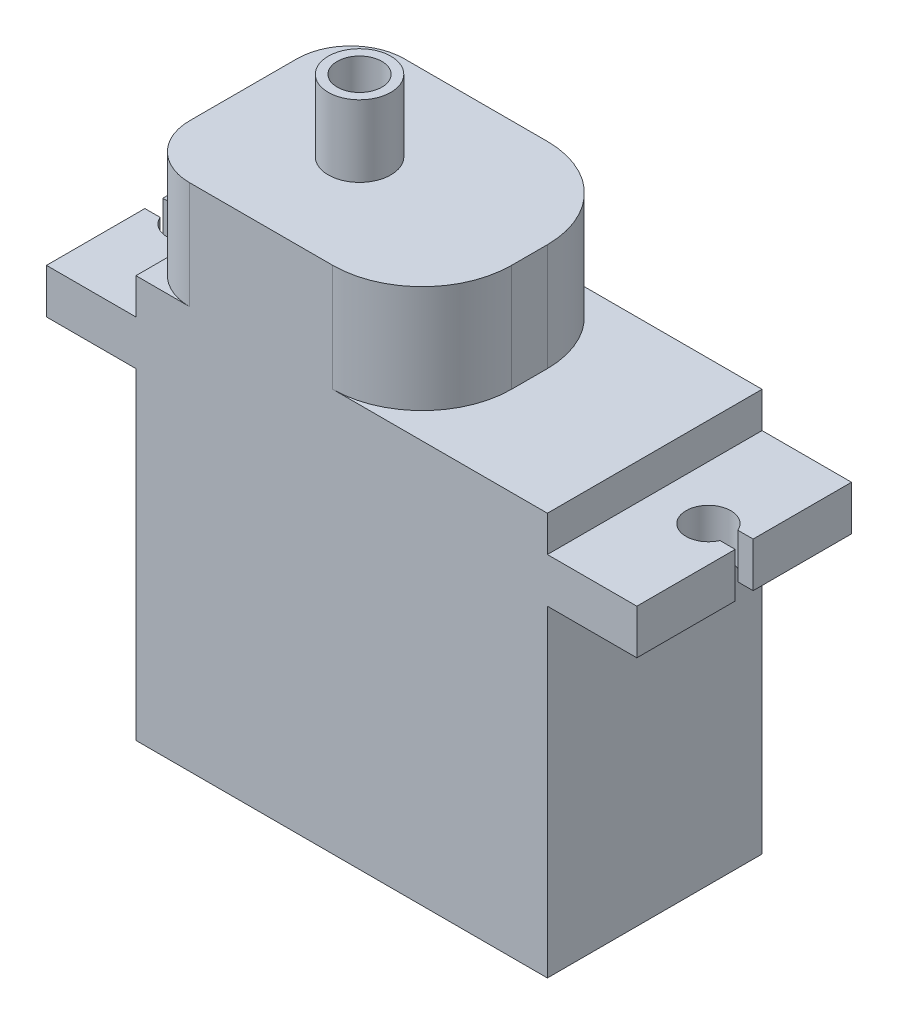
ISO-10303-21;
HEADER;
FILE_DESCRIPTION(('STEP AP214'),'2;1');
FILE_NAME('part.step','',(''),(''),'','','');
FILE_SCHEMA(('AUTOMOTIVE_DESIGN { 1 0 10303 214 1 1 1 1 }'));
ENDSEC;
DATA;
#1=APPLICATION_CONTEXT('core data for automotive mechanical design processes');
#2=APPLICATION_PROTOCOL_DEFINITION('international standard','automotive_design',2000,#1);
#3=PRODUCT_CONTEXT('',#1,'mechanical');
#4=PRODUCT('Part','Part','',(#3));
#5=PRODUCT_RELATED_PRODUCT_CATEGORY('part','',(#4));
#6=PRODUCT_DEFINITION_FORMATION('','',#4);
#7=PRODUCT_DEFINITION_CONTEXT('part definition',#1,'design');
#8=PRODUCT_DEFINITION('design','',#6,#7);
#9=PRODUCT_DEFINITION_SHAPE('','',#8);
#10=(LENGTH_UNIT() NAMED_UNIT(*) SI_UNIT(.MILLI.,.METRE.));
#11=(NAMED_UNIT(*) PLANE_ANGLE_UNIT() SI_UNIT($,.RADIAN.));
#12=(NAMED_UNIT(*) SI_UNIT($,.STERADIAN.) SOLID_ANGLE_UNIT());
#13=UNCERTAINTY_MEASURE_WITH_UNIT(LENGTH_MEASURE(1.E-05),#10,'distance_accuracy_value','');
#14=(GEOMETRIC_REPRESENTATION_CONTEXT(3) GLOBAL_UNCERTAINTY_ASSIGNED_CONTEXT((#13)) GLOBAL_UNIT_ASSIGNED_CONTEXT((#10,
#11,#12)) REPRESENTATION_CONTEXT('',''));
#15=CARTESIAN_POINT('',(0.,0.,0.));
#16=DIRECTION('',(0.,0.,1.));
#17=DIRECTION('',(1.,0.,0.));
#18=AXIS2_PLACEMENT_3D('',#15,#16,#17);
#19=CARTESIAN_POINT('',(0.,22.5,0.));
#20=DIRECTION('',(0.,1.,0.));
#21=DIRECTION('',(0.,0.,1.));
#22=AXIS2_PLACEMENT_3D('',#19,#20,#21);
#23=PLANE('',#22);
#24=DIRECTION('',(0.,0.,-1.));
#25=VECTOR('',#24,1.);
#26=CARTESIAN_POINT('',(4.5,22.5,-6.));
#27=LINE('',#26,#25);
#28=CARTESIAN_POINT('',(4.5,22.5,0.999999999999999));
#29=VERTEX_POINT('',#28);
#30=CARTESIAN_POINT('',(4.5,22.5,-1.));
#31=VERTEX_POINT('',#30);
#32=EDGE_CURVE('E255',#29,#31,#27,.T.);
#33=ORIENTED_EDGE('',*,*,#32,.F.);
#34=CARTESIAN_POINT('',(-0.499999999999996,22.5,0.999999999999999));
#35=DIRECTION('',(0.,1.,0.));
#36=DIRECTION('',(0.,0.,1.));
#37=AXIS2_PLACEMENT_3D('',#34,#35,#36);
#38=CIRCLE('',#37,5.);
#39=CARTESIAN_POINT('',(-0.499999999999996,22.5,6.));
#40=VERTEX_POINT('',#39);
#41=EDGE_CURVE('E11',#29,#40,#38,.F.);
#42=ORIENTED_EDGE('',*,*,#41,.T.);
#43=DIRECTION('',(1.,0.,0.));
#44=VECTOR('',#43,1.);
#45=CARTESIAN_POINT('',(-11.5,22.5,6.));
#46=LINE('',#45,#44);
#47=CARTESIAN_POINT('',(11.5,22.5,6.));
#48=VERTEX_POINT('',#47);
#49=EDGE_CURVE('E49',#40,#48,#46,.T.);
#50=ORIENTED_EDGE('',*,*,#49,.T.);
#51=DIRECTION('',(0.,0.,-1.));
#52=VECTOR('',#51,1.);
#53=CARTESIAN_POINT('',(11.5,22.5,-6.));
#54=LINE('',#53,#52);
#55=CARTESIAN_POINT('',(11.5,22.5,-6.));
#56=VERTEX_POINT('',#55);
#57=EDGE_CURVE('E369',#48,#56,#54,.T.);
#58=ORIENTED_EDGE('',*,*,#57,.T.);
#59=DIRECTION('',(-1.,0.,0.));
#60=VECTOR('',#59,1.);
#61=CARTESIAN_POINT('',(-11.5,22.5,-6.));
#62=LINE('',#61,#60);
#63=CARTESIAN_POINT('',(-0.499999999999997,22.5,-6.));
#64=VERTEX_POINT('',#63);
#65=EDGE_CURVE('E373',#56,#64,#62,.T.);
#66=ORIENTED_EDGE('',*,*,#65,.T.);
#67=CARTESIAN_POINT('',(-0.499999999999997,22.5,-1.));
#68=DIRECTION('',(0.,1.,0.));
#69=DIRECTION('',(0.,0.,1.));
#70=AXIS2_PLACEMENT_3D('',#67,#68,#69);
#71=CIRCLE('',#70,5.);
#72=EDGE_CURVE('E42',#64,#31,#71,.F.);
#73=ORIENTED_EDGE('',*,*,#72,.T.);
#74=EDGE_LOOP('',(#33,#42,#50,#58,#66,#73));
#75=FACE_BOUND('',#74,.T.);
#76=ADVANCED_FACE('F34',(#75),#23,.T.);
#77=CARTESIAN_POINT('',(-8.49999999999999,22.5,3.));
#78=DIRECTION('',(0.,1.,0.));
#79=DIRECTION('',(0.,0.,1.));
#80=AXIS2_PLACEMENT_3D('',#77,#78,#79);
#81=CIRCLE('',#80,3.);
#82=CARTESIAN_POINT('',(-11.5,22.5,3.));
#83=VERTEX_POINT('',#82);
#84=CARTESIAN_POINT('',(-8.49999999999999,22.5,6.));
#85=VERTEX_POINT('',#84);
#86=EDGE_CURVE('E261',#83,#85,#81,.T.);
#87=ORIENTED_EDGE('',*,*,#86,.F.);
#88=DIRECTION('',(0.,0.,1.));
#89=VECTOR('',#88,1.);
#90=CARTESIAN_POINT('',(-11.5,22.5,-6.));
#91=LINE('',#90,#89);
#92=CARTESIAN_POINT('',(-11.5,22.5,6.));
#93=VERTEX_POINT('',#92);
#94=EDGE_CURVE('E375',#83,#93,#91,.T.);
#95=ORIENTED_EDGE('',*,*,#94,.T.);
#96=EDGE_CURVE('E378',#93,#85,#46,.T.);
#97=ORIENTED_EDGE('',*,*,#96,.T.);
#98=EDGE_LOOP('',(#87,#95,#97));
#99=FACE_BOUND('',#98,.T.);
#100=ADVANCED_FACE('F507',(#99),#23,.T.);
#101=CARTESIAN_POINT('',(-16.5,20.5,6.));
#102=DIRECTION('',(0.,1.,0.));
#103=DIRECTION('',(0.,0.,1.));
#104=AXIS2_PLACEMENT_3D('',#101,#102,#103);
#105=PLANE('',#104);
#106=CARTESIAN_POINT('',(-14.5,20.5,0.));
#107=DIRECTION('',(0.,-1.,0.));
#108=DIRECTION('',(0.,0.,1.));
#109=AXIS2_PLACEMENT_3D('',#106,#107,#108);
#110=CIRCLE('',#109,1.25);
#111=CARTESIAN_POINT('',(-15.645643923739,20.5,-0.5));
#112=VERTEX_POINT('',#111);
#113=CARTESIAN_POINT('',(-15.645643923739,20.5,0.5));
#114=VERTEX_POINT('',#113);
#115=EDGE_CURVE('E239',#112,#114,#110,.T.);
#116=ORIENTED_EDGE('',*,*,#115,.T.);
#117=DIRECTION('',(-1.,0.,0.));
#118=VECTOR('',#117,1.);
#119=CARTESIAN_POINT('',(-16.5,20.5,0.5));
#120=LINE('',#119,#118);
#121=CARTESIAN_POINT('',(-16.5,20.5,0.5));
#122=VERTEX_POINT('',#121);
#123=EDGE_CURVE('E275',#114,#122,#120,.T.);
#124=ORIENTED_EDGE('',*,*,#123,.T.);
#125=DIRECTION('',(0.,0.,1.));
#126=VECTOR('',#125,1.);
#127=CARTESIAN_POINT('',(-16.5,20.5,6.));
#128=LINE('',#127,#126);
#129=CARTESIAN_POINT('',(-16.5,20.5,6.));
#130=VERTEX_POINT('',#129);
#131=EDGE_CURVE('E292',#122,#130,#128,.T.);
#132=ORIENTED_EDGE('',*,*,#131,.T.);
#133=DIRECTION('',(1.,0.,0.));
#134=VECTOR('',#133,1.);
#135=CARTESIAN_POINT('',(-16.5,20.5,6.));
#136=LINE('',#135,#134);
#137=CARTESIAN_POINT('',(-11.5,20.5,6.));
#138=VERTEX_POINT('',#137);
#139=EDGE_CURVE('E314',#130,#138,#136,.T.);
#140=ORIENTED_EDGE('',*,*,#139,.T.);
#141=DIRECTION('',(0.,0.,1.));
#142=VECTOR('',#141,1.);
#143=CARTESIAN_POINT('',(-11.5,20.5,6.));
#144=LINE('',#143,#142);
#145=CARTESIAN_POINT('',(-11.5,20.5,-6.));
#146=VERTEX_POINT('',#145);
#147=EDGE_CURVE('E288',#146,#138,#144,.T.);
#148=ORIENTED_EDGE('',*,*,#147,.F.);
#149=DIRECTION('',(1.,0.,0.));
#150=VECTOR('',#149,1.);
#151=CARTESIAN_POINT('',(-16.5,20.5,-6.));
#152=LINE('',#151,#150);
#153=CARTESIAN_POINT('',(-16.5,20.5,-6.));
#154=VERTEX_POINT('',#153);
#155=EDGE_CURVE('E312',#154,#146,#152,.T.);
#156=ORIENTED_EDGE('',*,*,#155,.F.);
#157=CARTESIAN_POINT('',(-16.5,20.5,-0.5));
#158=VERTEX_POINT('',#157);
#159=EDGE_CURVE('E294',#154,#158,#128,.T.);
#160=ORIENTED_EDGE('',*,*,#159,.T.);
#161=DIRECTION('',(1.,0.,0.));
#162=VECTOR('',#161,1.);
#163=CARTESIAN_POINT('',(-15.645643923739,20.5,-0.5));
#164=LINE('',#163,#162);
#165=EDGE_CURVE('E272',#158,#112,#164,.T.);
#166=ORIENTED_EDGE('',*,*,#165,.T.);
#167=EDGE_LOOP('',(#116,#124,#132,#140,#148,#156,#160,#166));
#168=FACE_BOUND('',#167,.T.);
#169=ADVANCED_FACE('F498',(#168),#105,.T.);
#170=CARTESIAN_POINT('',(-16.5,18.,6.));
#171=DIRECTION('',(0.,-1.,0.));
#172=DIRECTION('',(0.,0.,-1.));
#173=AXIS2_PLACEMENT_3D('',#170,#171,#172);
#174=PLANE('',#173);
#175=DIRECTION('',(0.,0.,-1.));
#176=VECTOR('',#175,1.);
#177=CARTESIAN_POINT('',(-16.5,18.,6.));
#178=LINE('',#177,#176);
#179=CARTESIAN_POINT('',(-16.5,18.,6.));
#180=VERTEX_POINT('',#179);
#181=CARTESIAN_POINT('',(-16.5,18.,0.5));
#182=VERTEX_POINT('',#181);
#183=EDGE_CURVE('E301',#180,#182,#178,.T.);
#184=ORIENTED_EDGE('',*,*,#183,.T.);
#185=DIRECTION('',(1.,0.,0.));
#186=VECTOR('',#185,1.);
#187=CARTESIAN_POINT('',(-16.5,18.,0.5));
#188=LINE('',#187,#186);
#189=CARTESIAN_POINT('',(-15.645643923739,18.,0.5));
#190=VERTEX_POINT('',#189);
#191=EDGE_CURVE('E285',#182,#190,#188,.T.);
#192=ORIENTED_EDGE('',*,*,#191,.T.);
#193=CARTESIAN_POINT('',(-14.5,18.,0.));
#194=DIRECTION('',(0.,-1.,0.));
#195=DIRECTION('',(0.,0.,-1.));
#196=AXIS2_PLACEMENT_3D('',#193,#194,#195);
#197=CIRCLE('',#196,1.25);
#198=CARTESIAN_POINT('',(-15.645643923739,18.,-0.5));
#199=VERTEX_POINT('',#198);
#200=EDGE_CURVE('E415',#190,#199,#197,.F.);
#201=ORIENTED_EDGE('',*,*,#200,.T.);
#202=DIRECTION('',(-1.,0.,0.));
#203=VECTOR('',#202,1.);
#204=CARTESIAN_POINT('',(-16.5,18.,-0.5));
#205=LINE('',#204,#203);
#206=CARTESIAN_POINT('',(-16.5,18.,-0.5));
#207=VERTEX_POINT('',#206);
#208=EDGE_CURVE('E281',#199,#207,#205,.T.);
#209=ORIENTED_EDGE('',*,*,#208,.T.);
#210=CARTESIAN_POINT('',(-16.5,18.,-6.));
#211=VERTEX_POINT('',#210);
#212=EDGE_CURVE('E300',#207,#211,#178,.T.);
#213=ORIENTED_EDGE('',*,*,#212,.T.);
#214=DIRECTION('',(1.,0.,0.));
#215=VECTOR('',#214,1.);
#216=CARTESIAN_POINT('',(-16.5,18.,-6.));
#217=LINE('',#216,#215);
#218=CARTESIAN_POINT('',(-11.5,18.,-6.));
#219=VERTEX_POINT('',#218);
#220=EDGE_CURVE('E310',#211,#219,#217,.T.);
#221=ORIENTED_EDGE('',*,*,#220,.T.);
#222=DIRECTION('',(0.,0.,-1.));
#223=VECTOR('',#222,1.);
#224=CARTESIAN_POINT('',(-11.5,18.,6.));
#225=LINE('',#224,#223);
#226=CARTESIAN_POINT('',(-11.5,18.,6.));
#227=VERTEX_POINT('',#226);
#228=EDGE_CURVE('E293',#227,#219,#225,.T.);
#229=ORIENTED_EDGE('',*,*,#228,.F.);
#230=DIRECTION('',(1.,0.,0.));
#231=VECTOR('',#230,1.);
#232=CARTESIAN_POINT('',(-16.5,18.,6.));
#233=LINE('',#232,#231);
#234=EDGE_CURVE('E304',#180,#227,#233,.T.);
#235=ORIENTED_EDGE('',*,*,#234,.F.);
#236=EDGE_LOOP('',(#184,#192,#201,#209,#213,#221,#229,#235));
#237=FACE_BOUND('',#236,.T.);
#238=ADVANCED_FACE('F490',(#237),#174,.T.);
#239=CARTESIAN_POINT('',(-16.5,0.,0.));
#240=DIRECTION('',(-1.,0.,0.));
#241=DIRECTION('',(0.,0.,-1.));
#242=AXIS2_PLACEMENT_3D('',#239,#240,#241);
#243=PLANE('',#242);
#244=ORIENTED_EDGE('',*,*,#131,.F.);
#245=DIRECTION('',(0.,-1.,0.));
#246=VECTOR('',#245,1.);
#247=CARTESIAN_POINT('',(-16.5,0.,0.5));
#248=LINE('',#247,#246);
#249=EDGE_CURVE('E412',#122,#182,#248,.T.);
#250=ORIENTED_EDGE('',*,*,#249,.T.);
#251=ORIENTED_EDGE('',*,*,#183,.F.);
#252=DIRECTION('',(0.,-1.,0.));
#253=VECTOR('',#252,1.);
#254=CARTESIAN_POINT('',(-16.5,20.5,6.));
#255=LINE('',#254,#253);
#256=EDGE_CURVE('E289',#130,#180,#255,.T.);
#257=ORIENTED_EDGE('',*,*,#256,.F.);
#258=EDGE_LOOP('',(#244,#250,#251,#257));
#259=FACE_BOUND('',#258,.T.);
#260=ADVANCED_FACE('F559',(#259),#243,.T.);
#261=ORIENTED_EDGE('',*,*,#212,.F.);
#262=DIRECTION('',(0.,1.,0.));
#263=VECTOR('',#262,1.);
#264=CARTESIAN_POINT('',(-16.5,0.,-0.5));
#265=LINE('',#264,#263);
#266=EDGE_CURVE('E409',#207,#158,#265,.T.);
#267=ORIENTED_EDGE('',*,*,#266,.T.);
#268=ORIENTED_EDGE('',*,*,#159,.F.);
#269=DIRECTION('',(0.,1.,0.));
#270=VECTOR('',#269,1.);
#271=CARTESIAN_POINT('',(-16.5,20.5,-6.));
#272=LINE('',#271,#270);
#273=EDGE_CURVE('E297',#211,#154,#272,.T.);
#274=ORIENTED_EDGE('',*,*,#273,.F.);
#275=EDGE_LOOP('',(#261,#267,#268,#274));
#276=FACE_BOUND('',#275,.T.);
#277=ADVANCED_FACE('F493',(#276),#243,.T.);
#278=CARTESIAN_POINT('',(-11.5,22.5,-6.));
#279=DIRECTION('',(1.,0.,0.));
#280=DIRECTION('',(0.,0.,-1.));
#281=AXIS2_PLACEMENT_3D('',#278,#279,#280);
#282=PLANE('',#281);
#283=DIRECTION('',(0.,-1.,0.));
#284=VECTOR('',#283,1.);
#285=CARTESIAN_POINT('',(-11.5,22.5,6.));
#286=LINE('',#285,#284);
#287=CARTESIAN_POINT('',(-11.5,0.,6.));
#288=VERTEX_POINT('',#287);
#289=EDGE_CURVE('E393',#227,#288,#286,.T.);
#290=ORIENTED_EDGE('',*,*,#289,.F.);
#291=ORIENTED_EDGE('',*,*,#228,.T.);
#292=DIRECTION('',(0.,-1.,0.));
#293=VECTOR('',#292,1.);
#294=CARTESIAN_POINT('',(-11.5,22.5,-6.));
#295=LINE('',#294,#293);
#296=CARTESIAN_POINT('',(-11.5,0.,-6.));
#297=VERTEX_POINT('',#296);
#298=EDGE_CURVE('E397',#219,#297,#295,.T.);
#299=ORIENTED_EDGE('',*,*,#298,.T.);
#300=DIRECTION('',(0.,0.,1.));
#301=VECTOR('',#300,1.);
#302=CARTESIAN_POINT('',(-11.5,0.,-6.));
#303=LINE('',#302,#301);
#304=EDGE_CURVE('E386',#297,#288,#303,.T.);
#305=ORIENTED_EDGE('',*,*,#304,.T.);
#306=EDGE_LOOP('',(#290,#291,#299,#305));
#307=FACE_BOUND('',#306,.T.);
#308=ADVANCED_FACE('F487',(#307),#282,.F.);
#309=CARTESIAN_POINT('',(16.5,0.,0.));
#310=DIRECTION('',(1.,0.,0.));
#311=DIRECTION('',(0.,0.,-1.));
#312=AXIS2_PLACEMENT_3D('',#309,#310,#311);
#313=PLANE('',#312);
#314=DIRECTION('',(0.,1.,0.));
#315=VECTOR('',#314,1.);
#316=CARTESIAN_POINT('',(16.5,0.,-0.5));
#317=LINE('',#316,#315);
#318=CARTESIAN_POINT('',(16.5,18.,-0.5));
#319=VERTEX_POINT('',#318);
#320=CARTESIAN_POINT('',(16.5,20.5,-0.5));
#321=VERTEX_POINT('',#320);
#322=EDGE_CURVE('E407',#319,#321,#317,.T.);
#323=ORIENTED_EDGE('',*,*,#322,.F.);
#324=DIRECTION('',(0.,0.,-1.));
#325=VECTOR('',#324,1.);
#326=CARTESIAN_POINT('',(16.5,18.,6.));
#327=LINE('',#326,#325);
#328=CARTESIAN_POINT('',(16.5,18.,-6.));
#329=VERTEX_POINT('',#328);
#330=EDGE_CURVE('E341',#319,#329,#327,.T.);
#331=ORIENTED_EDGE('',*,*,#330,.T.);
#332=DIRECTION('',(0.,1.,0.));
#333=VECTOR('',#332,1.);
#334=CARTESIAN_POINT('',(16.5,20.5,-6.));
#335=LINE('',#334,#333);
#336=CARTESIAN_POINT('',(16.5,20.5,-6.));
#337=VERTEX_POINT('',#336);
#338=EDGE_CURVE('E346',#329,#337,#335,.T.);
#339=ORIENTED_EDGE('',*,*,#338,.T.);
#340=DIRECTION('',(0.,0.,1.));
#341=VECTOR('',#340,1.);
#342=CARTESIAN_POINT('',(16.5,20.5,6.));
#343=LINE('',#342,#341);
#344=EDGE_CURVE('E349',#337,#321,#343,.T.);
#345=ORIENTED_EDGE('',*,*,#344,.T.);
#346=EDGE_LOOP('',(#323,#331,#339,#345));
#347=FACE_BOUND('',#346,.T.);
#348=ADVANCED_FACE('F468',(#347),#313,.T.);
#349=CARTESIAN_POINT('',(11.5,22.5,-6.));
#350=DIRECTION('',(-1.,0.,0.));
#351=DIRECTION('',(0.,0.,1.));
#352=AXIS2_PLACEMENT_3D('',#349,#350,#351);
#353=PLANE('',#352);
#354=DIRECTION('',(0.,0.,1.));
#355=VECTOR('',#354,1.);
#356=CARTESIAN_POINT('',(11.5,20.5,6.));
#357=LINE('',#356,#355);
#358=CARTESIAN_POINT('',(11.5,20.5,-6.));
#359=VERTEX_POINT('',#358);
#360=CARTESIAN_POINT('',(11.5,20.5,6.));
#361=VERTEX_POINT('',#360);
#362=EDGE_CURVE('E342',#359,#361,#357,.T.);
#363=ORIENTED_EDGE('',*,*,#362,.F.);
#364=DIRECTION('',(0.,-1.,0.));
#365=VECTOR('',#364,1.);
#366=CARTESIAN_POINT('',(11.5,22.5,-6.));
#367=LINE('',#366,#365);
#368=EDGE_CURVE('E402',#56,#359,#367,.T.);
#369=ORIENTED_EDGE('',*,*,#368,.F.);
#370=ORIENTED_EDGE('',*,*,#57,.F.);
#371=DIRECTION('',(0.,-1.,0.));
#372=VECTOR('',#371,1.);
#373=CARTESIAN_POINT('',(11.5,22.5,6.));
#374=LINE('',#373,#372);
#375=EDGE_CURVE('E391',#48,#361,#374,.T.);
#376=ORIENTED_EDGE('',*,*,#375,.T.);
#377=EDGE_LOOP('',(#363,#369,#370,#376));
#378=FACE_BOUND('',#377,.T.);
#379=ADVANCED_FACE('F442',(#378),#353,.F.);
#380=DIRECTION('',(0.,0.,-1.));
#381=VECTOR('',#380,1.);
#382=CARTESIAN_POINT('',(11.5,18.,6.));
#383=LINE('',#382,#381);
#384=CARTESIAN_POINT('',(11.5,18.,6.));
#385=VERTEX_POINT('',#384);
#386=CARTESIAN_POINT('',(11.5,18.,-6.));
#387=VERTEX_POINT('',#386);
#388=EDGE_CURVE('E337',#385,#387,#383,.T.);
#389=ORIENTED_EDGE('',*,*,#388,.F.);
#390=CARTESIAN_POINT('',(11.5,0.,6.));
#391=VERTEX_POINT('',#390);
#392=EDGE_CURVE('E380',#385,#391,#374,.T.);
#393=ORIENTED_EDGE('',*,*,#392,.T.);
#394=DIRECTION('',(0.,0.,-1.));
#395=VECTOR('',#394,1.);
#396=CARTESIAN_POINT('',(11.5,0.,-6.));
#397=LINE('',#396,#395);
#398=CARTESIAN_POINT('',(11.5,0.,-6.));
#399=VERTEX_POINT('',#398);
#400=EDGE_CURVE('E368',#391,#399,#397,.T.);
#401=ORIENTED_EDGE('',*,*,#400,.T.);
#402=EDGE_CURVE('E401',#387,#399,#367,.T.);
#403=ORIENTED_EDGE('',*,*,#402,.F.);
#404=EDGE_LOOP('',(#389,#393,#401,#403));
#405=FACE_BOUND('',#404,.T.);
#406=ADVANCED_FACE('F476',(#405),#353,.F.);
#407=CARTESIAN_POINT('',(-11.5,22.5,-6.));
#408=DIRECTION('',(0.,0.,1.));
#409=DIRECTION('',(1.,0.,0.));
#410=AXIS2_PLACEMENT_3D('',#407,#408,#409);
#411=PLANE('',#410);
#412=DIRECTION('',(-1.,0.,0.));
#413=VECTOR('',#412,1.);
#414=CARTESIAN_POINT('',(-8.49999999999998,28.5,-6.));
#415=LINE('',#414,#413);
#416=CARTESIAN_POINT('',(-0.499999999999997,28.5,-6.));
#417=VERTEX_POINT('',#416);
#418=CARTESIAN_POINT('',(-8.49999999999998,28.5,-6.));
#419=VERTEX_POINT('',#418);
#420=EDGE_CURVE('E217',#417,#419,#415,.T.);
#421=ORIENTED_EDGE('',*,*,#420,.F.);
#422=DIRECTION('',(0.,-1.,0.));
#423=VECTOR('',#422,1.);
#424=CARTESIAN_POINT('',(-0.499999999999997,22.5,-6.));
#425=LINE('',#424,#423);
#426=EDGE_CURVE('E418',#417,#64,#425,.T.);
#427=ORIENTED_EDGE('',*,*,#426,.T.);
#428=ORIENTED_EDGE('',*,*,#65,.F.);
#429=ORIENTED_EDGE('',*,*,#368,.T.);
#430=DIRECTION('',(-1.,0.,0.));
#431=VECTOR('',#430,1.);
#432=CARTESIAN_POINT('',(16.5,20.5,-6.));
#433=LINE('',#432,#431);
#434=EDGE_CURVE('E359',#337,#359,#433,.T.);
#435=ORIENTED_EDGE('',*,*,#434,.F.);
#436=ORIENTED_EDGE('',*,*,#338,.F.);
#437=DIRECTION('',(-1.,0.,0.));
#438=VECTOR('',#437,1.);
#439=CARTESIAN_POINT('',(16.5,18.,-6.));
#440=LINE('',#439,#438);
#441=EDGE_CURVE('E362',#329,#387,#440,.T.);
#442=ORIENTED_EDGE('',*,*,#441,.T.);
#443=ORIENTED_EDGE('',*,*,#402,.T.);
#444=DIRECTION('',(-1.,0.,0.));
#445=VECTOR('',#444,1.);
#446=CARTESIAN_POINT('',(-11.5,0.,-6.));
#447=LINE('',#446,#445);
#448=EDGE_CURVE('E383',#399,#297,#447,.T.);
#449=ORIENTED_EDGE('',*,*,#448,.T.);
#450=ORIENTED_EDGE('',*,*,#298,.F.);
#451=ORIENTED_EDGE('',*,*,#220,.F.);
#452=ORIENTED_EDGE('',*,*,#273,.T.);
#453=ORIENTED_EDGE('',*,*,#155,.T.);
#454=CARTESIAN_POINT('',(-11.5,22.5,-6.));
#455=VERTEX_POINT('',#454);
#456=EDGE_CURVE('E398',#455,#146,#295,.T.);
#457=ORIENTED_EDGE('',*,*,#456,.F.);
#458=CARTESIAN_POINT('',(-8.5,22.5,-6.));
#459=VERTEX_POINT('',#458);
#460=EDGE_CURVE('E236',#459,#455,#62,.T.);
#461=ORIENTED_EDGE('',*,*,#460,.F.);
#462=DIRECTION('',(0.,-1.,0.));
#463=VECTOR('',#462,1.);
#464=CARTESIAN_POINT('',(-8.49999999999998,28.5,-6.));
#465=LINE('',#464,#463);
#466=EDGE_CURVE('E233',#419,#459,#465,.T.);
#467=ORIENTED_EDGE('',*,*,#466,.F.);
#468=EDGE_LOOP('',(#421,#427,#428,#429,#435,#436,#442,#443,#449,#450,#451,#452,#453,#457,#461,#467));
#469=FACE_BOUND('',#468,.T.);
#470=ADVANCED_FACE('F234',(#469),#411,.F.);
#471=ORIENTED_EDGE('',*,*,#456,.T.);
#472=ORIENTED_EDGE('',*,*,#147,.T.);
#473=EDGE_CURVE('E394',#93,#138,#286,.T.);
#474=ORIENTED_EDGE('',*,*,#473,.F.);
#475=ORIENTED_EDGE('',*,*,#94,.F.);
#476=DIRECTION('',(0.,-1.,0.));
#477=VECTOR('',#476,1.);
#478=CARTESIAN_POINT('',(-11.5,28.5,2.99999999999998));
#479=LINE('',#478,#477);
#480=CARTESIAN_POINT('',(-11.5,28.5,2.99999999999998));
#481=VERTEX_POINT('',#480);
#482=EDGE_CURVE('E266',#481,#83,#479,.T.);
#483=ORIENTED_EDGE('',*,*,#482,.F.);
#484=DIRECTION('',(0.,0.,1.));
#485=VECTOR('',#484,1.);
#486=CARTESIAN_POINT('',(-11.5,28.5,-2.99999999999998));
#487=LINE('',#486,#485);
#488=CARTESIAN_POINT('',(-11.5,28.5,-2.99999999999998));
#489=VERTEX_POINT('',#488);
#490=EDGE_CURVE('E245',#489,#481,#487,.T.);
#491=ORIENTED_EDGE('',*,*,#490,.F.);
#492=DIRECTION('',(0.,-1.,0.));
#493=VECTOR('',#492,1.);
#494=CARTESIAN_POINT('',(-11.5,28.5,-2.99999999999998));
#495=LINE('',#494,#493);
#496=CARTESIAN_POINT('',(-11.5,22.5,-2.99999999999998));
#497=VERTEX_POINT('',#496);
#498=EDGE_CURVE('E240',#489,#497,#495,.T.);
#499=ORIENTED_EDGE('',*,*,#498,.T.);
#500=EDGE_CURVE('E376',#455,#497,#91,.T.);
#501=ORIENTED_EDGE('',*,*,#500,.F.);
#502=EDGE_LOOP('',(#471,#472,#474,#475,#483,#491,#499,#501));
#503=FACE_BOUND('',#502,.T.);
#504=ADVANCED_FACE('F502',(#503),#282,.F.);
#505=CARTESIAN_POINT('',(-11.5,22.5,6.));
#506=DIRECTION('',(0.,0.,-1.));
#507=DIRECTION('',(-1.,0.,0.));
#508=AXIS2_PLACEMENT_3D('',#505,#506,#507);
#509=PLANE('',#508);
#510=ORIENTED_EDGE('',*,*,#49,.F.);
#511=DIRECTION('',(0.,-1.,0.));
#512=VECTOR('',#511,1.);
#513=CARTESIAN_POINT('',(-0.499999999999997,22.5,6.));
#514=LINE('',#513,#512);
#515=CARTESIAN_POINT('',(-0.499999999999997,28.5,6.));
#516=VERTEX_POINT('',#515);
#517=EDGE_CURVE('E53',#40,#516,#514,.F.);
#518=ORIENTED_EDGE('',*,*,#517,.T.);
#519=DIRECTION('',(1.,0.,0.));
#520=VECTOR('',#519,1.);
#521=CARTESIAN_POINT('',(-8.49999999999997,28.5,6.));
#522=LINE('',#521,#520);
#523=CARTESIAN_POINT('',(-8.49999999999997,28.5,6.));
#524=VERTEX_POINT('',#523);
#525=EDGE_CURVE('E252',#524,#516,#522,.T.);
#526=ORIENTED_EDGE('',*,*,#525,.F.);
#527=DIRECTION('',(0.,-1.,0.));
#528=VECTOR('',#527,1.);
#529=CARTESIAN_POINT('',(-8.49999999999997,28.5,6.));
#530=LINE('',#529,#528);
#531=EDGE_CURVE('E254',#524,#85,#530,.T.);
#532=ORIENTED_EDGE('',*,*,#531,.T.);
#533=ORIENTED_EDGE('',*,*,#96,.F.);
#534=ORIENTED_EDGE('',*,*,#473,.T.);
#535=ORIENTED_EDGE('',*,*,#139,.F.);
#536=ORIENTED_EDGE('',*,*,#256,.T.);
#537=ORIENTED_EDGE('',*,*,#234,.T.);
#538=ORIENTED_EDGE('',*,*,#289,.T.);
#539=DIRECTION('',(1.,0.,0.));
#540=VECTOR('',#539,1.);
#541=CARTESIAN_POINT('',(-11.5,0.,6.));
#542=LINE('',#541,#540);
#543=EDGE_CURVE('E372',#288,#391,#542,.T.);
#544=ORIENTED_EDGE('',*,*,#543,.T.);
#545=ORIENTED_EDGE('',*,*,#392,.F.);
#546=DIRECTION('',(-1.,0.,0.));
#547=VECTOR('',#546,1.);
#548=CARTESIAN_POINT('',(16.5,18.,6.));
#549=LINE('',#548,#547);
#550=CARTESIAN_POINT('',(16.5,18.,6.));
#551=VERTEX_POINT('',#550);
#552=EDGE_CURVE('E365',#551,#385,#549,.T.);
#553=ORIENTED_EDGE('',*,*,#552,.F.);
#554=DIRECTION('',(0.,-1.,0.));
#555=VECTOR('',#554,1.);
#556=CARTESIAN_POINT('',(16.5,20.5,6.));
#557=LINE('',#556,#555);
#558=CARTESIAN_POINT('',(16.5,20.5,6.));
#559=VERTEX_POINT('',#558);
#560=EDGE_CURVE('E338',#559,#551,#557,.T.);
#561=ORIENTED_EDGE('',*,*,#560,.F.);
#562=DIRECTION('',(-1.,0.,0.));
#563=VECTOR('',#562,1.);
#564=CARTESIAN_POINT('',(16.5,20.5,6.));
#565=LINE('',#564,#563);
#566=EDGE_CURVE('E352',#559,#361,#565,.T.);
#567=ORIENTED_EDGE('',*,*,#566,.T.);
#568=ORIENTED_EDGE('',*,*,#375,.F.);
#569=EDGE_LOOP('',(#510,#518,#526,#532,#533,#534,#535,#536,#537,#538,#544,#545,#553,#561,#567,#568));
#570=FACE_BOUND('',#569,.T.);
#571=ADVANCED_FACE('F450',(#570),#509,.F.);
#572=CARTESIAN_POINT('',(-8.5,22.5,-3.));
#573=DIRECTION('',(0.,1.,0.));
#574=DIRECTION('',(0.,0.,1.));
#575=AXIS2_PLACEMENT_3D('',#572,#573,#574);
#576=CIRCLE('',#575,3.);
#577=EDGE_CURVE('E258',#459,#497,#576,.T.);
#578=ORIENTED_EDGE('',*,*,#577,.F.);
#579=ORIENTED_EDGE('',*,*,#460,.T.);
#580=ORIENTED_EDGE('',*,*,#500,.T.);
#581=EDGE_LOOP('',(#578,#579,#580));
#582=FACE_BOUND('',#581,.T.);
#583=ADVANCED_FACE('F504',(#582),#23,.T.);
#584=CARTESIAN_POINT('',(0.,0.,0.));
#585=DIRECTION('',(0.,1.,0.));
#586=DIRECTION('',(0.,0.,1.));
#587=AXIS2_PLACEMENT_3D('',#584,#585,#586);
#588=PLANE('',#587);
#589=ORIENTED_EDGE('',*,*,#400,.F.);
#590=ORIENTED_EDGE('',*,*,#543,.F.);
#591=ORIENTED_EDGE('',*,*,#304,.F.);
#592=ORIENTED_EDGE('',*,*,#448,.F.);
#593=EDGE_LOOP('',(#589,#590,#591,#592));
#594=FACE_BOUND('',#593,.T.);
#595=ADVANCED_FACE('F482',(#594),#588,.F.);
#596=CARTESIAN_POINT('',(16.5,18.,6.));
#597=DIRECTION('',(0.,1.,0.));
#598=DIRECTION('',(0.,0.,1.));
#599=AXIS2_PLACEMENT_3D('',#596,#597,#598);
#600=PLANE('',#599);
#601=ORIENTED_EDGE('',*,*,#330,.F.);
#602=DIRECTION('',(-1.,0.,0.));
#603=VECTOR('',#602,1.);
#604=CARTESIAN_POINT('',(16.5,18.,-0.5));
#605=LINE('',#604,#603);
#606=CARTESIAN_POINT('',(15.645643923739,18.,-0.5));
#607=VERTEX_POINT('',#606);
#608=EDGE_CURVE('E331',#319,#607,#605,.T.);
#609=ORIENTED_EDGE('',*,*,#608,.T.);
#610=CARTESIAN_POINT('',(14.5,18.,0.));
#611=DIRECTION('',(0.,1.,0.));
#612=DIRECTION('',(0.,0.,1.));
#613=AXIS2_PLACEMENT_3D('',#610,#611,#612);
#614=CIRCLE('',#613,1.25);
#615=CARTESIAN_POINT('',(15.645643923739,18.,0.5));
#616=VERTEX_POINT('',#615);
#617=EDGE_CURVE('E334',#607,#616,#614,.T.);
#618=ORIENTED_EDGE('',*,*,#617,.T.);
#619=DIRECTION('',(1.,0.,0.));
#620=VECTOR('',#619,1.);
#621=CARTESIAN_POINT('',(16.5,18.,0.5));
#622=LINE('',#621,#620);
#623=CARTESIAN_POINT('',(16.5,18.,0.5));
#624=VERTEX_POINT('',#623);
#625=EDGE_CURVE('E327',#616,#624,#622,.T.);
#626=ORIENTED_EDGE('',*,*,#625,.T.);
#627=EDGE_CURVE('E343',#551,#624,#327,.T.);
#628=ORIENTED_EDGE('',*,*,#627,.F.);
#629=ORIENTED_EDGE('',*,*,#552,.T.);
#630=ORIENTED_EDGE('',*,*,#388,.T.);
#631=ORIENTED_EDGE('',*,*,#441,.F.);
#632=EDGE_LOOP('',(#601,#609,#618,#626,#628,#629,#630,#631));
#633=FACE_BOUND('',#632,.T.);
#634=ADVANCED_FACE('F474',(#633),#600,.F.);
#635=CARTESIAN_POINT('',(16.5,20.5,6.));
#636=DIRECTION('',(0.,-1.,0.));
#637=DIRECTION('',(0.,0.,-1.));
#638=AXIS2_PLACEMENT_3D('',#635,#636,#637);
#639=PLANE('',#638);
#640=CARTESIAN_POINT('',(14.5,20.5,0.));
#641=DIRECTION('',(0.,1.,0.));
#642=DIRECTION('',(0.,0.,1.));
#643=AXIS2_PLACEMENT_3D('',#640,#641,#642);
#644=CIRCLE('',#643,1.25);
#645=CARTESIAN_POINT('',(15.645643923739,20.5,-0.5));
#646=VERTEX_POINT('',#645);
#647=CARTESIAN_POINT('',(15.645643923739,20.5,0.5));
#648=VERTEX_POINT('',#647);
#649=EDGE_CURVE('E316',#646,#648,#644,.T.);
#650=ORIENTED_EDGE('',*,*,#649,.F.);
#651=DIRECTION('',(-1.,0.,0.));
#652=VECTOR('',#651,1.);
#653=CARTESIAN_POINT('',(15.645643923739,20.5,-0.5));
#654=LINE('',#653,#652);
#655=EDGE_CURVE('E321',#321,#646,#654,.T.);
#656=ORIENTED_EDGE('',*,*,#655,.F.);
#657=ORIENTED_EDGE('',*,*,#344,.F.);
#658=ORIENTED_EDGE('',*,*,#434,.T.);
#659=ORIENTED_EDGE('',*,*,#362,.T.);
#660=ORIENTED_EDGE('',*,*,#566,.F.);
#661=CARTESIAN_POINT('',(16.5,20.5,0.5));
#662=VERTEX_POINT('',#661);
#663=EDGE_CURVE('E348',#662,#559,#343,.T.);
#664=ORIENTED_EDGE('',*,*,#663,.F.);
#665=DIRECTION('',(1.,0.,0.));
#666=VECTOR('',#665,1.);
#667=CARTESIAN_POINT('',(16.5,20.5,0.5));
#668=LINE('',#667,#666);
#669=EDGE_CURVE('E319',#648,#662,#668,.T.);
#670=ORIENTED_EDGE('',*,*,#669,.F.);
#671=EDGE_LOOP('',(#650,#656,#657,#658,#659,#660,#664,#670));
#672=FACE_BOUND('',#671,.T.);
#673=ADVANCED_FACE('F446',(#672),#639,.F.);
#674=DIRECTION('',(0.,-1.,0.));
#675=VECTOR('',#674,1.);
#676=CARTESIAN_POINT('',(16.5,0.,0.5));
#677=LINE('',#676,#675);
#678=EDGE_CURVE('E405',#662,#624,#677,.T.);
#679=ORIENTED_EDGE('',*,*,#678,.F.);
#680=ORIENTED_EDGE('',*,*,#663,.T.);
#681=ORIENTED_EDGE('',*,*,#560,.T.);
#682=ORIENTED_EDGE('',*,*,#627,.T.);
#683=EDGE_LOOP('',(#679,#680,#681,#682));
#684=FACE_BOUND('',#683,.T.);
#685=ADVANCED_FACE('F455',(#684),#313,.T.);
#686=CARTESIAN_POINT('',(14.5,15.5,0.));
#687=DIRECTION('',(0.,1.,0.));
#688=DIRECTION('',(0.,0.,1.));
#689=AXIS2_PLACEMENT_3D('',#686,#687,#688);
#690=CYLINDRICAL_SURFACE('',#689,1.25);
#691=DIRECTION('',(0.,1.,0.));
#692=VECTOR('',#691,1.);
#693=CARTESIAN_POINT('',(15.645643923739,15.5,-0.5));
#694=LINE('',#693,#692);
#695=EDGE_CURVE('E325',#607,#646,#694,.T.);
#696=ORIENTED_EDGE('',*,*,#695,.T.);
#697=ORIENTED_EDGE('',*,*,#649,.T.);
#698=DIRECTION('',(0.,1.,0.));
#699=VECTOR('',#698,1.);
#700=CARTESIAN_POINT('',(15.645643923739,15.5,0.5));
#701=LINE('',#700,#699);
#702=EDGE_CURVE('E324',#616,#648,#701,.T.);
#703=ORIENTED_EDGE('',*,*,#702,.F.);
#704=ORIENTED_EDGE('',*,*,#617,.F.);
#705=EDGE_LOOP('',(#696,#697,#703,#704));
#706=FACE_BOUND('',#705,.T.);
#707=ADVANCED_FACE('F462',(#706),#690,.F.);
#708=CARTESIAN_POINT('',(15.645643923739,15.5,-0.5));
#709=DIRECTION('',(0.,0.,-1.));
#710=DIRECTION('',(-1.,0.,0.));
#711=AXIS2_PLACEMENT_3D('',#708,#709,#710);
#712=PLANE('',#711);
#713=ORIENTED_EDGE('',*,*,#322,.T.);
#714=ORIENTED_EDGE('',*,*,#655,.T.);
#715=ORIENTED_EDGE('',*,*,#695,.F.);
#716=ORIENTED_EDGE('',*,*,#608,.F.);
#717=EDGE_LOOP('',(#713,#714,#715,#716));
#718=FACE_BOUND('',#717,.T.);
#719=ADVANCED_FACE('F465',(#718),#712,.F.);
#720=CARTESIAN_POINT('',(16.5,15.5,0.5));
#721=DIRECTION('',(0.,0.,1.));
#722=DIRECTION('',(1.,0.,0.));
#723=AXIS2_PLACEMENT_3D('',#720,#721,#722);
#724=PLANE('',#723);
#725=ORIENTED_EDGE('',*,*,#702,.T.);
#726=ORIENTED_EDGE('',*,*,#669,.T.);
#727=ORIENTED_EDGE('',*,*,#678,.T.);
#728=ORIENTED_EDGE('',*,*,#625,.F.);
#729=EDGE_LOOP('',(#725,#726,#727,#728));
#730=FACE_BOUND('',#729,.T.);
#731=ADVANCED_FACE('F459',(#730),#724,.F.);
#732=CARTESIAN_POINT('',(-14.5,15.5,0.));
#733=DIRECTION('',(0.,1.,0.));
#734=DIRECTION('',(0.,0.,1.));
#735=AXIS2_PLACEMENT_3D('',#732,#733,#734);
#736=CYLINDRICAL_SURFACE('',#735,1.25);
#737=DIRECTION('',(0.,1.,0.));
#738=VECTOR('',#737,1.);
#739=CARTESIAN_POINT('',(-15.645643923739,15.5,0.5));
#740=LINE('',#739,#738);
#741=EDGE_CURVE('E279',#190,#114,#740,.T.);
#742=ORIENTED_EDGE('',*,*,#741,.T.);
#743=ORIENTED_EDGE('',*,*,#115,.F.);
#744=DIRECTION('',(0.,1.,0.));
#745=VECTOR('',#744,1.);
#746=CARTESIAN_POINT('',(-15.645643923739,15.5,-0.5));
#747=LINE('',#746,#745);
#748=EDGE_CURVE('E278',#199,#112,#747,.T.);
#749=ORIENTED_EDGE('',*,*,#748,.F.);
#750=ORIENTED_EDGE('',*,*,#200,.F.);
#751=EDGE_LOOP('',(#742,#743,#749,#750));
#752=FACE_BOUND('',#751,.T.);
#753=ADVANCED_FACE('F567',(#752),#736,.F.);
#754=CARTESIAN_POINT('',(-16.5,15.5,0.5));
#755=DIRECTION('',(0.,0.,-1.));
#756=DIRECTION('',(-1.,0.,0.));
#757=AXIS2_PLACEMENT_3D('',#754,#755,#756);
#758=PLANE('',#757);
#759=ORIENTED_EDGE('',*,*,#249,.F.);
#760=ORIENTED_EDGE('',*,*,#123,.F.);
#761=ORIENTED_EDGE('',*,*,#741,.F.);
#762=ORIENTED_EDGE('',*,*,#191,.F.);
#763=EDGE_LOOP('',(#759,#760,#761,#762));
#764=FACE_BOUND('',#763,.T.);
#765=ADVANCED_FACE('F612',(#764),#758,.T.);
#766=CARTESIAN_POINT('',(-15.645643923739,15.5,-0.5));
#767=DIRECTION('',(0.,0.,1.));
#768=DIRECTION('',(1.,0.,0.));
#769=AXIS2_PLACEMENT_3D('',#766,#767,#768);
#770=PLANE('',#769);
#771=ORIENTED_EDGE('',*,*,#748,.T.);
#772=ORIENTED_EDGE('',*,*,#165,.F.);
#773=ORIENTED_EDGE('',*,*,#266,.F.);
#774=ORIENTED_EDGE('',*,*,#208,.F.);
#775=EDGE_LOOP('',(#771,#772,#773,#774));
#776=FACE_BOUND('',#775,.T.);
#777=ADVANCED_FACE('F619',(#776),#770,.T.);
#778=CARTESIAN_POINT('',(4.5,28.5,-6.));
#779=DIRECTION('',(-1.,0.,0.));
#780=DIRECTION('',(0.,0.,1.));
#781=AXIS2_PLACEMENT_3D('',#778,#779,#780);
#782=PLANE('',#781);
#783=ORIENTED_EDGE('',*,*,#32,.T.);
#784=DIRECTION('',(0.,-1.,0.));
#785=VECTOR('',#784,1.);
#786=CARTESIAN_POINT('',(4.5,28.5,-1.));
#787=LINE('',#786,#785);
#788=CARTESIAN_POINT('',(4.5,28.5,-1.));
#789=VERTEX_POINT('',#788);
#790=EDGE_CURVE('E423',#31,#789,#787,.F.);
#791=ORIENTED_EDGE('',*,*,#790,.T.);
#792=DIRECTION('',(0.,0.,-1.));
#793=VECTOR('',#792,1.);
#794=CARTESIAN_POINT('',(4.5,28.5,-6.));
#795=LINE('',#794,#793);
#796=CARTESIAN_POINT('',(4.5,28.5,0.999999999999999));
#797=VERTEX_POINT('',#796);
#798=EDGE_CURVE('E229',#797,#789,#795,.T.);
#799=ORIENTED_EDGE('',*,*,#798,.F.);
#800=DIRECTION('',(0.,-1.,0.));
#801=VECTOR('',#800,1.);
#802=CARTESIAN_POINT('',(4.5,28.5,0.999999999999999));
#803=LINE('',#802,#801);
#804=EDGE_CURVE('E420',#797,#29,#803,.T.);
#805=ORIENTED_EDGE('',*,*,#804,.T.);
#806=EDGE_LOOP('',(#783,#791,#799,#805));
#807=FACE_BOUND('',#806,.T.);
#808=ADVANCED_FACE('F434',(#807),#782,.F.);
#809=CARTESIAN_POINT('',(-8.5,28.5,-3.));
#810=DIRECTION('',(0.,-1.,0.));
#811=DIRECTION('',(0.,0.,-1.));
#812=AXIS2_PLACEMENT_3D('',#809,#810,#811);
#813=CYLINDRICAL_SURFACE('',#812,3.);
#814=ORIENTED_EDGE('',*,*,#577,.T.);
#815=ORIENTED_EDGE('',*,*,#498,.F.);
#816=CARTESIAN_POINT('',(-8.5,28.5,-3.));
#817=DIRECTION('',(0.,1.,0.));
#818=DIRECTION('',(0.,0.,1.));
#819=AXIS2_PLACEMENT_3D('',#816,#817,#818);
#820=CIRCLE('',#819,3.);
#821=EDGE_CURVE('E222',#419,#489,#820,.T.);
#822=ORIENTED_EDGE('',*,*,#821,.F.);
#823=ORIENTED_EDGE('',*,*,#466,.T.);
#824=EDGE_LOOP('',(#814,#815,#822,#823));
#825=FACE_BOUND('',#824,.T.);
#826=ADVANCED_FACE('F242',(#825),#813,.T.);
#827=CARTESIAN_POINT('',(-8.49999999999999,28.5,3.));
#828=DIRECTION('',(0.,-1.,0.));
#829=DIRECTION('',(0.,0.,-1.));
#830=AXIS2_PLACEMENT_3D('',#827,#828,#829);
#831=CYLINDRICAL_SURFACE('',#830,3.);
#832=ORIENTED_EDGE('',*,*,#86,.T.);
#833=ORIENTED_EDGE('',*,*,#531,.F.);
#834=CARTESIAN_POINT('',(-8.49999999999999,28.5,3.));
#835=DIRECTION('',(0.,1.,0.));
#836=DIRECTION('',(0.,0.,1.));
#837=AXIS2_PLACEMENT_3D('',#834,#835,#836);
#838=CIRCLE('',#837,3.);
#839=EDGE_CURVE('E247',#481,#524,#838,.T.);
#840=ORIENTED_EDGE('',*,*,#839,.F.);
#841=ORIENTED_EDGE('',*,*,#482,.T.);
#842=EDGE_LOOP('',(#832,#833,#840,#841));
#843=FACE_BOUND('',#842,.T.);
#844=ADVANCED_FACE('F528',(#843),#831,.T.);
#845=CARTESIAN_POINT('',(-8.49999999999999,28.5,3.));
#846=DIRECTION('',(0.,1.,0.));
#847=DIRECTION('',(0.,0.,1.));
#848=AXIS2_PLACEMENT_3D('',#845,#846,#847);
#849=PLANE('',#848);
#850=CARTESIAN_POINT('',(-5.,28.5,0.));
#851=DIRECTION('',(0.,1.,0.));
#852=DIRECTION('',(0.,0.,1.));
#853=AXIS2_PLACEMENT_3D('',#850,#851,#852);
#854=CIRCLE('',#853,1.75);
#855=CARTESIAN_POINT('',(-5.,28.5,1.75));
#856=VERTEX_POINT('',#855);
#857=EDGE_CURVE('E696',#856,#856,#854,.T.);
#858=ORIENTED_EDGE('',*,*,#857,.F.);
#859=EDGE_LOOP('',(#858));
#860=FACE_BOUND('',#859,.T.);
#861=ORIENTED_EDGE('',*,*,#798,.T.);
#862=CARTESIAN_POINT('',(-0.499999999999997,28.5,-1.));
#863=DIRECTION('',(0.,1.,0.));
#864=DIRECTION('',(0.,0.,1.));
#865=AXIS2_PLACEMENT_3D('',#862,#863,#864);
#866=CIRCLE('',#865,5.);
#867=EDGE_CURVE('E225',#789,#417,#866,.T.);
#868=ORIENTED_EDGE('',*,*,#867,.T.);
#869=ORIENTED_EDGE('',*,*,#420,.T.);
#870=ORIENTED_EDGE('',*,*,#821,.T.);
#871=ORIENTED_EDGE('',*,*,#490,.T.);
#872=ORIENTED_EDGE('',*,*,#839,.T.);
#873=ORIENTED_EDGE('',*,*,#525,.T.);
#874=CARTESIAN_POINT('',(-0.499999999999996,28.5,0.999999999999999));
#875=DIRECTION('',(0.,1.,0.));
#876=DIRECTION('',(0.,0.,1.));
#877=AXIS2_PLACEMENT_3D('',#874,#875,#876);
#878=CIRCLE('',#877,5.);
#879=EDGE_CURVE('E425',#516,#797,#878,.T.);
#880=ORIENTED_EDGE('',*,*,#879,.T.);
#881=EDGE_LOOP('',(#861,#868,#869,#870,#871,#872,#873,#880));
#882=FACE_BOUND('',#881,.T.);
#883=ADVANCED_FACE('F220',(#860,#882),#849,.T.);
#884=CARTESIAN_POINT('',(-0.499999999999997,22.5,-1.));
#885=DIRECTION('',(0.,-1.,0.));
#886=DIRECTION('',(0.,0.,-1.));
#887=AXIS2_PLACEMENT_3D('',#884,#885,#886);
#888=CYLINDRICAL_SURFACE('',#887,5.);
#889=ORIENTED_EDGE('',*,*,#867,.F.);
#890=ORIENTED_EDGE('',*,*,#790,.F.);
#891=ORIENTED_EDGE('',*,*,#72,.F.);
#892=ORIENTED_EDGE('',*,*,#426,.F.);
#893=EDGE_LOOP('',(#889,#890,#891,#892));
#894=FACE_BOUND('',#893,.T.);
#895=ADVANCED_FACE('F437',(#894),#888,.T.);
#896=CARTESIAN_POINT('',(-0.499999999999996,28.5,0.999999999999999));
#897=DIRECTION('',(0.,-1.,0.));
#898=DIRECTION('',(0.,0.,-1.));
#899=AXIS2_PLACEMENT_3D('',#896,#897,#898);
#900=CYLINDRICAL_SURFACE('',#899,5.);
#901=ORIENTED_EDGE('',*,*,#879,.F.);
#902=ORIENTED_EDGE('',*,*,#517,.F.);
#903=ORIENTED_EDGE('',*,*,#41,.F.);
#904=ORIENTED_EDGE('',*,*,#804,.F.);
#905=EDGE_LOOP('',(#901,#902,#903,#904));
#906=FACE_BOUND('',#905,.T.);
#907=ADVANCED_FACE('F36',(#906),#900,.T.);
#908=CARTESIAN_POINT('',(-5.,32.5,0.));
#909=DIRECTION('',(0.,-1.,0.));
#910=DIRECTION('',(0.,0.,-1.));
#911=AXIS2_PLACEMENT_3D('',#908,#909,#910);
#912=CYLINDRICAL_SURFACE('',#911,1.75);
#913=CARTESIAN_POINT('',(-5.,32.5,0.));
#914=DIRECTION('',(0.,1.,0.));
#915=DIRECTION('',(0.,0.,1.));
#916=AXIS2_PLACEMENT_3D('',#913,#914,#915);
#917=CIRCLE('',#916,1.75);
#918=CARTESIAN_POINT('',(-5.,32.5,1.75));
#919=VERTEX_POINT('',#918);
#920=EDGE_CURVE('E259',#919,#919,#917,.T.);
#921=ORIENTED_EDGE('',*,*,#920,.F.);
#922=EDGE_LOOP('',(#921));
#923=FACE_BOUND('',#922,.T.);
#924=ORIENTED_EDGE('',*,*,#857,.T.);
#925=EDGE_LOOP('',(#924));
#926=FACE_BOUND('',#925,.T.);
#927=ADVANCED_FACE('F532',(#923,#926),#912,.T.);
#928=CARTESIAN_POINT('',(-5.,32.5,0.));
#929=DIRECTION('',(0.,1.,0.));
#930=DIRECTION('',(0.,0.,1.));
#931=AXIS2_PLACEMENT_3D('',#928,#929,#930);
#932=PLANE('',#931);
#933=CARTESIAN_POINT('',(-5.,32.5,0.));
#934=DIRECTION('',(0.,1.,0.));
#935=DIRECTION('',(0.,0.,1.));
#936=AXIS2_PLACEMENT_3D('',#933,#934,#935);
#937=CIRCLE('',#936,1.25);
#938=CARTESIAN_POINT('',(-5.,32.5,1.25));
#939=VERTEX_POINT('',#938);
#940=EDGE_CURVE('E697',#939,#939,#937,.T.);
#941=ORIENTED_EDGE('',*,*,#940,.F.);
#942=EDGE_LOOP('',(#941));
#943=FACE_BOUND('',#942,.T.);
#944=ORIENTED_EDGE('',*,*,#920,.T.);
#945=EDGE_LOOP('',(#944));
#946=FACE_BOUND('',#945,.T.);
#947=ADVANCED_FACE('F537',(#943,#946),#932,.T.);
#948=CARTESIAN_POINT('',(-5.,28.5,0.));
#949=DIRECTION('',(0.,1.,0.));
#950=DIRECTION('',(0.,0.,1.));
#951=AXIS2_PLACEMENT_3D('',#948,#949,#950);
#952=CYLINDRICAL_SURFACE('',#951,1.25);
#953=CARTESIAN_POINT('',(-5.,28.5,0.));
#954=DIRECTION('',(0.,1.,0.));
#955=DIRECTION('',(0.,0.,1.));
#956=AXIS2_PLACEMENT_3D('',#953,#954,#955);
#957=CIRCLE('',#956,1.25);
#958=CARTESIAN_POINT('',(-5.,28.5,1.25));
#959=VERTEX_POINT('',#958);
#960=EDGE_CURVE('E695',#959,#959,#957,.T.);
#961=ORIENTED_EDGE('',*,*,#960,.F.);
#962=EDGE_LOOP('',(#961));
#963=FACE_BOUND('',#962,.T.);
#964=ORIENTED_EDGE('',*,*,#940,.T.);
#965=EDGE_LOOP('',(#964));
#966=FACE_BOUND('',#965,.T.);
#967=ADVANCED_FACE('F669',(#963,#966),#952,.F.);
#968=CARTESIAN_POINT('',(-5.,28.5,0.));
#969=DIRECTION('',(0.,1.,0.));
#970=DIRECTION('',(0.,0.,1.));
#971=AXIS2_PLACEMENT_3D('',#968,#969,#970);
#972=PLANE('',#971);
#973=ORIENTED_EDGE('',*,*,#960,.T.);
#974=EDGE_LOOP('',(#973));
#975=FACE_BOUND('',#974,.T.);
#976=ADVANCED_FACE('F679',(#975),#972,.T.);
#977=CLOSED_SHELL('',(#76,#100,#169,#238,#260,#277,#308,#348,#379,#406,#470,#504,#571,#583,#595,
#634,#673,#685,#707,#719,#731,#753,#765,#777,#808,#826,#844,#883,#895,#907,#927,#947,#967,#976));
#978=MANIFOLD_SOLID_BREP('B2',#977);
#979=ADVANCED_BREP_SHAPE_REPRESENTATION('',(#18,#978),#14);
#980=SHAPE_DEFINITION_REPRESENTATION(#9,#979);
ENDSEC;
END-ISO-10303-21;
